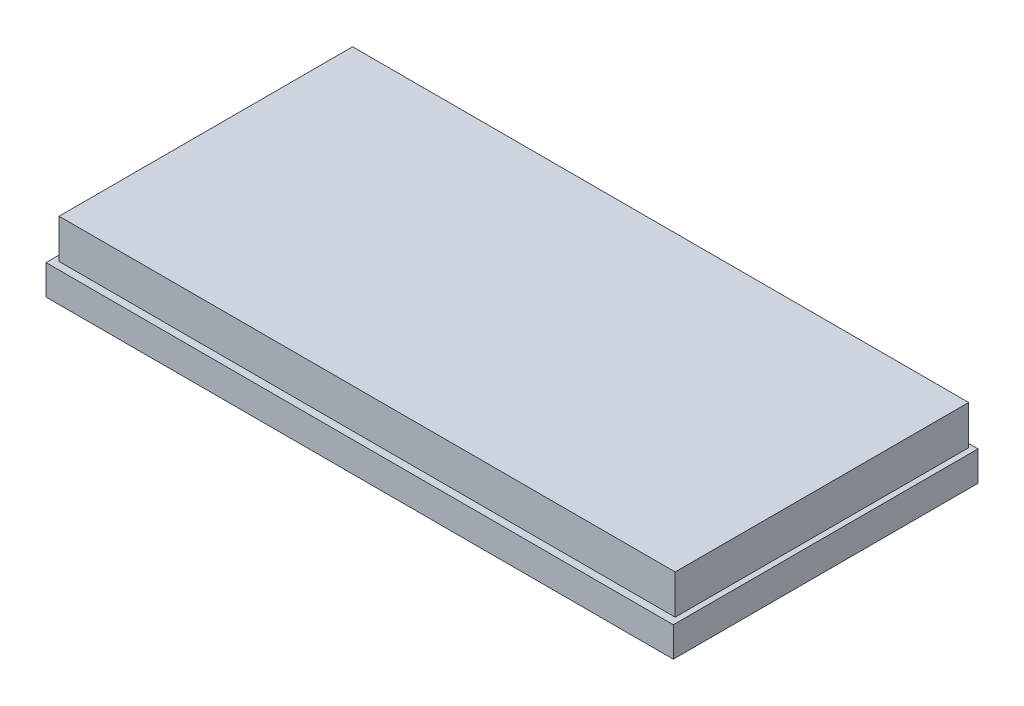
ISO-10303-21;
HEADER;
FILE_DESCRIPTION(('STEP AP214'),'2;1');
FILE_NAME('part.step','',(''),(''),'','','');
FILE_SCHEMA(('AUTOMOTIVE_DESIGN { 1 0 10303 214 1 1 1 1 }'));
ENDSEC;
DATA;
#1=APPLICATION_CONTEXT('core data for automotive mechanical design processes');
#2=APPLICATION_PROTOCOL_DEFINITION('international standard','automotive_design',2000,#1);
#3=PRODUCT_CONTEXT('',#1,'mechanical');
#4=PRODUCT('Part','Part','',(#3));
#5=PRODUCT_RELATED_PRODUCT_CATEGORY('part','',(#4));
#6=PRODUCT_DEFINITION_FORMATION('','',#4);
#7=PRODUCT_DEFINITION_CONTEXT('part definition',#1,'design');
#8=PRODUCT_DEFINITION('design','',#6,#7);
#9=PRODUCT_DEFINITION_SHAPE('','',#8);
#10=(LENGTH_UNIT() NAMED_UNIT(*) SI_UNIT(.MILLI.,.METRE.));
#11=(NAMED_UNIT(*) PLANE_ANGLE_UNIT() SI_UNIT($,.RADIAN.));
#12=(NAMED_UNIT(*) SI_UNIT($,.STERADIAN.) SOLID_ANGLE_UNIT());
#13=UNCERTAINTY_MEASURE_WITH_UNIT(LENGTH_MEASURE(1.E-05),#10,'distance_accuracy_value','');
#14=(GEOMETRIC_REPRESENTATION_CONTEXT(3) GLOBAL_UNCERTAINTY_ASSIGNED_CONTEXT((#13)) GLOBAL_UNIT_ASSIGNED_CONTEXT((#10,
#11,#12)) REPRESENTATION_CONTEXT('',''));
#15=CARTESIAN_POINT('',(0.,0.,0.));
#16=DIRECTION('',(0.,0.,1.));
#17=DIRECTION('',(1.,0.,0.));
#18=AXIS2_PLACEMENT_3D('',#15,#16,#17);
#19=CARTESIAN_POINT('',(82.5,10.5,39.3));
#20=DIRECTION('',(-1.,0.,0.));
#21=DIRECTION('',(0.,0.,1.));
#22=AXIS2_PLACEMENT_3D('',#19,#20,#21);
#23=PLANE('',#22);
#24=DIRECTION('',(0.,0.,-1.));
#25=VECTOR('',#24,1.);
#26=CARTESIAN_POINT('',(82.5,0.,39.3));
#27=LINE('',#26,#25);
#28=CARTESIAN_POINT('',(82.5,0.,39.3));
#29=VERTEX_POINT('',#28);
#30=CARTESIAN_POINT('',(82.5,0.,-39.3));
#31=VERTEX_POINT('',#30);
#32=EDGE_CURVE('E118',#29,#31,#27,.T.);
#33=ORIENTED_EDGE('',*,*,#32,.T.);
#34=DIRECTION('',(0.,-1.,0.));
#35=VECTOR('',#34,1.);
#36=CARTESIAN_POINT('',(82.5,10.5,-39.3));
#37=LINE('',#36,#35);
#38=CARTESIAN_POINT('',(82.5,10.5,-39.3));
#39=VERTEX_POINT('',#38);
#40=EDGE_CURVE('E11',#39,#31,#37,.T.);
#41=ORIENTED_EDGE('',*,*,#40,.F.);
#42=DIRECTION('',(0.,0.,-1.));
#43=VECTOR('',#42,1.);
#44=CARTESIAN_POINT('',(82.5,10.5,39.3));
#45=LINE('',#44,#43);
#46=CARTESIAN_POINT('',(82.5,10.5,39.3));
#47=VERTEX_POINT('',#46);
#48=EDGE_CURVE('E127',#47,#39,#45,.T.);
#49=ORIENTED_EDGE('',*,*,#48,.F.);
#50=DIRECTION('',(0.,-1.,0.));
#51=VECTOR('',#50,1.);
#52=CARTESIAN_POINT('',(82.5,10.5,39.3));
#53=LINE('',#52,#51);
#54=EDGE_CURVE('E134',#47,#29,#53,.T.);
#55=ORIENTED_EDGE('',*,*,#54,.T.);
#56=EDGE_LOOP('',(#33,#41,#49,#55));
#57=FACE_BOUND('',#56,.T.);
#58=ADVANCED_FACE('F33',(#57),#23,.F.);
#59=CARTESIAN_POINT('',(-82.5,10.5,-39.3));
#60=DIRECTION('',(0.,0.,1.));
#61=DIRECTION('',(1.,0.,0.));
#62=AXIS2_PLACEMENT_3D('',#59,#60,#61);
#63=PLANE('',#62);
#64=DIRECTION('',(-1.,0.,0.));
#65=VECTOR('',#64,1.);
#66=CARTESIAN_POINT('',(-82.5,0.,-39.3));
#67=LINE('',#66,#65);
#68=CARTESIAN_POINT('',(-82.5,0.,-39.3));
#69=VERTEX_POINT('',#68);
#70=EDGE_CURVE('E121',#31,#69,#67,.T.);
#71=ORIENTED_EDGE('',*,*,#70,.T.);
#72=DIRECTION('',(0.,-1.,0.));
#73=VECTOR('',#72,1.);
#74=CARTESIAN_POINT('',(-82.5,10.5,-39.3));
#75=LINE('',#74,#73);
#76=CARTESIAN_POINT('',(-82.5,10.5,-39.3));
#77=VERTEX_POINT('',#76);
#78=EDGE_CURVE('E41',#77,#69,#75,.T.);
#79=ORIENTED_EDGE('',*,*,#78,.F.);
#80=DIRECTION('',(-1.,0.,0.));
#81=VECTOR('',#80,1.);
#82=CARTESIAN_POINT('',(-82.5,10.5,-39.3));
#83=LINE('',#82,#81);
#84=EDGE_CURVE('E129',#39,#77,#83,.T.);
#85=ORIENTED_EDGE('',*,*,#84,.F.);
#86=ORIENTED_EDGE('',*,*,#40,.T.);
#87=EDGE_LOOP('',(#71,#79,#85,#86));
#88=FACE_BOUND('',#87,.T.);
#89=ADVANCED_FACE('F155',(#88),#63,.F.);
#90=CARTESIAN_POINT('',(-82.5,10.5,39.3));
#91=DIRECTION('',(1.,0.,0.));
#92=DIRECTION('',(0.,0.,-1.));
#93=AXIS2_PLACEMENT_3D('',#90,#91,#92);
#94=PLANE('',#93);
#95=DIRECTION('',(0.,0.,1.));
#96=VECTOR('',#95,1.);
#97=CARTESIAN_POINT('',(-82.5,0.,39.3));
#98=LINE('',#97,#96);
#99=CARTESIAN_POINT('',(-82.5,0.,39.3));
#100=VERTEX_POINT('',#99);
#101=EDGE_CURVE('E138',#69,#100,#98,.T.);
#102=ORIENTED_EDGE('',*,*,#101,.T.);
#103=DIRECTION('',(0.,-1.,0.));
#104=VECTOR('',#103,1.);
#105=CARTESIAN_POINT('',(-82.5,10.5,39.3));
#106=LINE('',#105,#104);
#107=CARTESIAN_POINT('',(-82.5,10.5,39.3));
#108=VERTEX_POINT('',#107);
#109=EDGE_CURVE('E145',#108,#100,#106,.T.);
#110=ORIENTED_EDGE('',*,*,#109,.F.);
#111=DIRECTION('',(0.,0.,1.));
#112=VECTOR('',#111,1.);
#113=CARTESIAN_POINT('',(-82.5,10.5,39.3));
#114=LINE('',#113,#112);
#115=EDGE_CURVE('E132',#77,#108,#114,.T.);
#116=ORIENTED_EDGE('',*,*,#115,.F.);
#117=ORIENTED_EDGE('',*,*,#78,.T.);
#118=EDGE_LOOP('',(#102,#110,#116,#117));
#119=FACE_BOUND('',#118,.T.);
#120=ADVANCED_FACE('F151',(#119),#94,.F.);
#121=CARTESIAN_POINT('',(-82.5,10.5,39.3));
#122=DIRECTION('',(0.,0.,-1.));
#123=DIRECTION('',(-1.,0.,0.));
#124=AXIS2_PLACEMENT_3D('',#121,#122,#123);
#125=PLANE('',#124);
#126=DIRECTION('',(1.,0.,0.));
#127=VECTOR('',#126,1.);
#128=CARTESIAN_POINT('',(-82.5,0.,39.3));
#129=LINE('',#128,#127);
#130=EDGE_CURVE('E130',#100,#29,#129,.T.);
#131=ORIENTED_EDGE('',*,*,#130,.T.);
#132=ORIENTED_EDGE('',*,*,#54,.F.);
#133=DIRECTION('',(1.,0.,0.));
#134=VECTOR('',#133,1.);
#135=CARTESIAN_POINT('',(-82.5,10.5,39.3));
#136=LINE('',#135,#134);
#137=EDGE_CURVE('E48',#108,#47,#136,.T.);
#138=ORIENTED_EDGE('',*,*,#137,.F.);
#139=ORIENTED_EDGE('',*,*,#109,.T.);
#140=EDGE_LOOP('',(#131,#132,#138,#139));
#141=FACE_BOUND('',#140,.T.);
#142=ADVANCED_FACE('F161',(#141),#125,.F.);
#143=CARTESIAN_POINT('',(0.,10.5,0.));
#144=DIRECTION('',(0.,-1.,0.));
#145=DIRECTION('',(0.,0.,-1.));
#146=AXIS2_PLACEMENT_3D('',#143,#144,#145);
#147=PLANE('',#146);
#148=ORIENTED_EDGE('',*,*,#48,.T.);
#149=ORIENTED_EDGE('',*,*,#84,.T.);
#150=ORIENTED_EDGE('',*,*,#115,.T.);
#151=ORIENTED_EDGE('',*,*,#137,.T.);
#152=EDGE_LOOP('',(#148,#149,#150,#151));
#153=FACE_BOUND('',#152,.T.);
#154=ADVANCED_FACE('F164',(#153),#147,.F.);
#155=CARTESIAN_POINT('',(-84.,-8.,41.3));
#156=DIRECTION('',(1.,0.,0.));
#157=DIRECTION('',(0.,0.,-1.));
#158=AXIS2_PLACEMENT_3D('',#155,#156,#157);
#159=PLANE('',#158);
#160=DIRECTION('',(0.,0.,-1.));
#161=VECTOR('',#160,1.);
#162=CARTESIAN_POINT('',(-84.,0.,41.3));
#163=LINE('',#162,#161);
#164=CARTESIAN_POINT('',(-84.,0.,41.3));
#165=VERTEX_POINT('',#164);
#166=CARTESIAN_POINT('',(-84.,0.,-40.3));
#167=VERTEX_POINT('',#166);
#168=EDGE_CURVE('E117',#165,#167,#163,.T.);
#169=ORIENTED_EDGE('',*,*,#168,.T.);
#170=DIRECTION('',(0.,1.,0.));
#171=VECTOR('',#170,1.);
#172=CARTESIAN_POINT('',(-84.,-8.,-40.3));
#173=LINE('',#172,#171);
#174=CARTESIAN_POINT('',(-84.,-8.,-40.3));
#175=VERTEX_POINT('',#174);
#176=EDGE_CURVE('E97',#175,#167,#173,.T.);
#177=ORIENTED_EDGE('',*,*,#176,.F.);
#178=DIRECTION('',(0.,0.,-1.));
#179=VECTOR('',#178,1.);
#180=CARTESIAN_POINT('',(-84.,-8.,41.3));
#181=LINE('',#180,#179);
#182=CARTESIAN_POINT('',(-84.,-8.,41.3));
#183=VERTEX_POINT('',#182);
#184=EDGE_CURVE('E104',#183,#175,#181,.T.);
#185=ORIENTED_EDGE('',*,*,#184,.F.);
#186=DIRECTION('',(0.,1.,0.));
#187=VECTOR('',#186,1.);
#188=CARTESIAN_POINT('',(-84.,-8.,41.3));
#189=LINE('',#188,#187);
#190=EDGE_CURVE('E244',#183,#165,#189,.T.);
#191=ORIENTED_EDGE('',*,*,#190,.T.);
#192=EDGE_LOOP('',(#169,#177,#185,#191));
#193=FACE_BOUND('',#192,.T.);
#194=ADVANCED_FACE('F115',(#193),#159,.F.);
#195=CARTESIAN_POINT('',(-84.,-8.,-40.3));
#196=DIRECTION('',(0.,0.,1.));
#197=DIRECTION('',(1.,0.,0.));
#198=AXIS2_PLACEMENT_3D('',#195,#196,#197);
#199=PLANE('',#198);
#200=DIRECTION('',(1.,0.,0.));
#201=VECTOR('',#200,1.);
#202=CARTESIAN_POINT('',(-84.,0.,-40.3));
#203=LINE('',#202,#201);
#204=CARTESIAN_POINT('',(84.,0.,-40.3));
#205=VERTEX_POINT('',#204);
#206=EDGE_CURVE('E250',#167,#205,#203,.T.);
#207=ORIENTED_EDGE('',*,*,#206,.T.);
#208=DIRECTION('',(0.,1.,0.));
#209=VECTOR('',#208,1.);
#210=CARTESIAN_POINT('',(84.,-8.,-40.3));
#211=LINE('',#210,#209);
#212=CARTESIAN_POINT('',(84.,-8.,-40.3));
#213=VERTEX_POINT('',#212);
#214=EDGE_CURVE('E100',#213,#205,#211,.T.);
#215=ORIENTED_EDGE('',*,*,#214,.F.);
#216=DIRECTION('',(1.,0.,0.));
#217=VECTOR('',#216,1.);
#218=CARTESIAN_POINT('',(-84.,-8.,-40.3));
#219=LINE('',#218,#217);
#220=EDGE_CURVE('E93',#175,#213,#219,.T.);
#221=ORIENTED_EDGE('',*,*,#220,.F.);
#222=ORIENTED_EDGE('',*,*,#176,.T.);
#223=EDGE_LOOP('',(#207,#215,#221,#222));
#224=FACE_BOUND('',#223,.T.);
#225=ADVANCED_FACE('F95',(#224),#199,.F.);
#226=CARTESIAN_POINT('',(84.,-8.,41.3));
#227=DIRECTION('',(-1.,0.,0.));
#228=DIRECTION('',(0.,0.,1.));
#229=AXIS2_PLACEMENT_3D('',#226,#227,#228);
#230=PLANE('',#229);
#231=DIRECTION('',(0.,0.,1.));
#232=VECTOR('',#231,1.);
#233=CARTESIAN_POINT('',(84.,0.,41.3));
#234=LINE('',#233,#232);
#235=CARTESIAN_POINT('',(84.,0.,41.3));
#236=VERTEX_POINT('',#235);
#237=EDGE_CURVE('E247',#205,#236,#234,.T.);
#238=ORIENTED_EDGE('',*,*,#237,.T.);
#239=DIRECTION('',(0.,1.,0.));
#240=VECTOR('',#239,1.);
#241=CARTESIAN_POINT('',(84.,-8.,41.3));
#242=LINE('',#241,#240);
#243=CARTESIAN_POINT('',(84.,-8.,41.3));
#244=VERTEX_POINT('',#243);
#245=EDGE_CURVE('E123',#244,#236,#242,.T.);
#246=ORIENTED_EDGE('',*,*,#245,.F.);
#247=DIRECTION('',(0.,0.,1.));
#248=VECTOR('',#247,1.);
#249=CARTESIAN_POINT('',(84.,-8.,41.3));
#250=LINE('',#249,#248);
#251=EDGE_CURVE('E103',#213,#244,#250,.T.);
#252=ORIENTED_EDGE('',*,*,#251,.F.);
#253=ORIENTED_EDGE('',*,*,#214,.T.);
#254=EDGE_LOOP('',(#238,#246,#252,#253));
#255=FACE_BOUND('',#254,.T.);
#256=ADVANCED_FACE('F203',(#255),#230,.F.);
#257=CARTESIAN_POINT('',(-84.,-8.,41.3));
#258=DIRECTION('',(0.,0.,-1.));
#259=DIRECTION('',(-1.,0.,0.));
#260=AXIS2_PLACEMENT_3D('',#257,#258,#259);
#261=PLANE('',#260);
#262=DIRECTION('',(-1.,0.,0.));
#263=VECTOR('',#262,1.);
#264=CARTESIAN_POINT('',(-84.,0.,41.3));
#265=LINE('',#264,#263);
#266=EDGE_CURVE('E113',#236,#165,#265,.T.);
#267=ORIENTED_EDGE('',*,*,#266,.T.);
#268=ORIENTED_EDGE('',*,*,#190,.F.);
#269=DIRECTION('',(-1.,0.,0.));
#270=VECTOR('',#269,1.);
#271=CARTESIAN_POINT('',(-84.,-8.,41.3));
#272=LINE('',#271,#270);
#273=EDGE_CURVE('E109',#244,#183,#272,.T.);
#274=ORIENTED_EDGE('',*,*,#273,.F.);
#275=ORIENTED_EDGE('',*,*,#245,.T.);
#276=EDGE_LOOP('',(#267,#268,#274,#275));
#277=FACE_BOUND('',#276,.T.);
#278=ADVANCED_FACE('F212',(#277),#261,.F.);
#279=CARTESIAN_POINT('',(0.,-8.,0.));
#280=DIRECTION('',(0.,-1.,0.));
#281=DIRECTION('',(0.,0.,-1.));
#282=AXIS2_PLACEMENT_3D('',#279,#280,#281);
#283=PLANE('',#282);
#284=ORIENTED_EDGE('',*,*,#184,.T.);
#285=ORIENTED_EDGE('',*,*,#220,.T.);
#286=ORIENTED_EDGE('',*,*,#251,.T.);
#287=ORIENTED_EDGE('',*,*,#273,.T.);
#288=EDGE_LOOP('',(#284,#285,#286,#287));
#289=FACE_BOUND('',#288,.T.);
#290=ADVANCED_FACE('F107',(#289),#283,.T.);
#291=CARTESIAN_POINT('',(0.,0.,0.));
#292=DIRECTION('',(0.,-1.,0.));
#293=DIRECTION('',(0.,0.,-1.));
#294=AXIS2_PLACEMENT_3D('',#291,#292,#293);
#295=PLANE('',#294);
#296=ORIENTED_EDGE('',*,*,#32,.F.);
#297=ORIENTED_EDGE('',*,*,#130,.F.);
#298=ORIENTED_EDGE('',*,*,#101,.F.);
#299=ORIENTED_EDGE('',*,*,#70,.F.);
#300=EDGE_LOOP('',(#296,#297,#298,#299));
#301=FACE_BOUND('',#300,.T.);
#302=ORIENTED_EDGE('',*,*,#168,.F.);
#303=ORIENTED_EDGE('',*,*,#266,.F.);
#304=ORIENTED_EDGE('',*,*,#237,.F.);
#305=ORIENTED_EDGE('',*,*,#206,.F.);
#306=EDGE_LOOP('',(#302,#303,#304,#305));
#307=FACE_BOUND('',#306,.T.);
#308=ADVANCED_FACE('F158',(#301,#307),#295,.F.);
#309=CLOSED_SHELL('',(#58,#89,#120,#142,#154,#194,#225,#256,#278,#290,#308));
#310=MANIFOLD_SOLID_BREP('B2',#309);
#311=ADVANCED_BREP_SHAPE_REPRESENTATION('',(#18,#310),#14);
#312=SHAPE_DEFINITION_REPRESENTATION(#9,#311);
ENDSEC;
END-ISO-10303-21;
